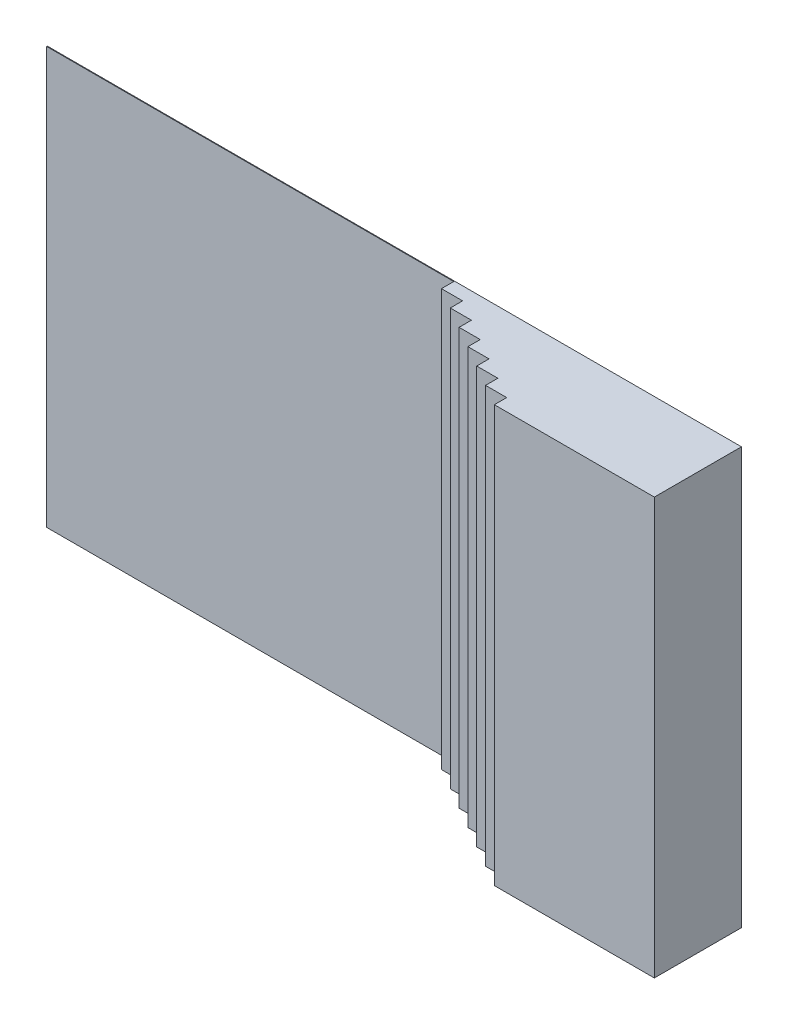
ISO-10303-21;
HEADER;
FILE_DESCRIPTION(('STEP AP214'),'2;1');
FILE_NAME('part.step','',(''),(''),'','','');
FILE_SCHEMA(('AUTOMOTIVE_DESIGN { 1 0 10303 214 1 1 1 1 }'));
ENDSEC;
DATA;
#1=APPLICATION_CONTEXT('core data for automotive mechanical design processes');
#2=APPLICATION_PROTOCOL_DEFINITION('international standard','automotive_design',2000,#1);
#3=PRODUCT_CONTEXT('',#1,'mechanical');
#4=PRODUCT('Part','Part','',(#3));
#5=PRODUCT_RELATED_PRODUCT_CATEGORY('part','',(#4));
#6=PRODUCT_DEFINITION_FORMATION('','',#4);
#7=PRODUCT_DEFINITION_CONTEXT('part definition',#1,'design');
#8=PRODUCT_DEFINITION('design','',#6,#7);
#9=PRODUCT_DEFINITION_SHAPE('','',#8);
#10=(LENGTH_UNIT() NAMED_UNIT(*) SI_UNIT(.MILLI.,.METRE.));
#11=(NAMED_UNIT(*) PLANE_ANGLE_UNIT() SI_UNIT($,.RADIAN.));
#12=(NAMED_UNIT(*) SI_UNIT($,.STERADIAN.) SOLID_ANGLE_UNIT());
#13=UNCERTAINTY_MEASURE_WITH_UNIT(LENGTH_MEASURE(1.E-05),#10,'distance_accuracy_value','');
#14=(GEOMETRIC_REPRESENTATION_CONTEXT(3) GLOBAL_UNCERTAINTY_ASSIGNED_CONTEXT((#13)) GLOBAL_UNIT_ASSIGNED_CONTEXT((#10,
#11,#12)) REPRESENTATION_CONTEXT('',''));
#15=CARTESIAN_POINT('',(0.,0.,0.));
#16=DIRECTION('',(0.,0.,1.));
#17=DIRECTION('',(1.,0.,0.));
#18=AXIS2_PLACEMENT_3D('',#15,#16,#17);
#19=CARTESIAN_POINT('',(-2500.,3000.,-10.));
#20=DIRECTION('',(-1.,0.,0.));
#21=DIRECTION('',(0.,-1.,0.));
#22=AXIS2_PLACEMENT_3D('',#19,#20,#21);
#23=PLANE('',#22);
#24=DIRECTION('',(0.,-1.,0.));
#25=VECTOR('',#24,1.);
#26=CARTESIAN_POINT('',(-2500.,3000.,0.));
#27=LINE('',#26,#25);
#28=CARTESIAN_POINT('',(-2500.,3000.,0.));
#29=VERTEX_POINT('',#28);
#30=CARTESIAN_POINT('',(-2500.,-3000.,0.));
#31=VERTEX_POINT('',#30);
#32=EDGE_CURVE('E298',#29,#31,#27,.T.);
#33=ORIENTED_EDGE('',*,*,#32,.F.);
#34=DIRECTION('',(0.,0.,1.));
#35=VECTOR('',#34,1.);
#36=CARTESIAN_POINT('',(-2500.,3000.,-10.));
#37=LINE('',#36,#35);
#38=CARTESIAN_POINT('',(-2500.,3000.,-10.));
#39=VERTEX_POINT('',#38);
#40=EDGE_CURVE('E11',#39,#29,#37,.T.);
#41=ORIENTED_EDGE('',*,*,#40,.F.);
#42=DIRECTION('',(0.,-1.,0.));
#43=VECTOR('',#42,1.);
#44=CARTESIAN_POINT('',(-2500.,3000.,-10.));
#45=LINE('',#44,#43);
#46=CARTESIAN_POINT('',(-2500.,-3000.,-10.));
#47=VERTEX_POINT('',#46);
#48=EDGE_CURVE('E299',#39,#47,#45,.T.);
#49=ORIENTED_EDGE('',*,*,#48,.T.);
#50=DIRECTION('',(0.,0.,1.));
#51=VECTOR('',#50,1.);
#52=CARTESIAN_POINT('',(-2500.,-3000.,-10.));
#53=LINE('',#52,#51);
#54=EDGE_CURVE('E46',#47,#31,#53,.T.);
#55=ORIENTED_EDGE('',*,*,#54,.T.);
#56=EDGE_LOOP('',(#33,#41,#49,#55));
#57=FACE_BOUND('',#56,.T.);
#58=ADVANCED_FACE('F43',(#57),#23,.T.);
#59=CARTESIAN_POINT('',(-2500.,3000.,-10.));
#60=DIRECTION('',(0.,1.,0.));
#61=DIRECTION('',(0.,0.,1.));
#62=AXIS2_PLACEMENT_3D('',#59,#60,#61);
#63=PLANE('',#62);
#64=DIRECTION('',(-1.,0.,0.));
#65=VECTOR('',#64,1.);
#66=CARTESIAN_POINT('',(-2500.,3000.,0.));
#67=LINE('',#66,#65);
#68=CARTESIAN_POINT('',(3366.4,3000.,0.));
#69=VERTEX_POINT('',#68);
#70=EDGE_CURVE('E80',#69,#29,#67,.T.);
#71=ORIENTED_EDGE('',*,*,#70,.F.);
#72=DIRECTION('',(0.,0.,-1.));
#73=VECTOR('',#72,1.);
#74=CARTESIAN_POINT('',(3366.4,3000.,0.));
#75=LINE('',#74,#73);
#76=CARTESIAN_POINT('',(3366.4,3000.,177.8));
#77=VERTEX_POINT('',#76);
#78=EDGE_CURVE('E217',#77,#69,#75,.T.);
#79=ORIENTED_EDGE('',*,*,#78,.F.);
#80=DIRECTION('',(-1.,0.,0.));
#81=VECTOR('',#80,1.);
#82=CARTESIAN_POINT('',(3366.4,3000.,177.8));
#83=LINE('',#82,#81);
#84=CARTESIAN_POINT('',(3671.2,3000.,177.8));
#85=VERTEX_POINT('',#84);
#86=EDGE_CURVE('E222',#85,#77,#83,.T.);
#87=ORIENTED_EDGE('',*,*,#86,.F.);
#88=DIRECTION('',(0.,0.,-1.));
#89=VECTOR('',#88,1.);
#90=CARTESIAN_POINT('',(3671.2,3000.,177.8));
#91=LINE('',#90,#89);
#92=CARTESIAN_POINT('',(3671.2,3000.,355.6));
#93=VERTEX_POINT('',#92);
#94=EDGE_CURVE('E227',#93,#85,#91,.T.);
#95=ORIENTED_EDGE('',*,*,#94,.F.);
#96=DIRECTION('',(-1.,0.,0.));
#97=VECTOR('',#96,1.);
#98=CARTESIAN_POINT('',(3671.2,3000.,355.6));
#99=LINE('',#98,#97);
#100=CARTESIAN_POINT('',(3976.,3000.,355.6));
#101=VERTEX_POINT('',#100);
#102=EDGE_CURVE('E232',#101,#93,#99,.T.);
#103=ORIENTED_EDGE('',*,*,#102,.F.);
#104=DIRECTION('',(0.,0.,-1.));
#105=VECTOR('',#104,1.);
#106=CARTESIAN_POINT('',(3976.,3000.,355.6));
#107=LINE('',#106,#105);
#108=CARTESIAN_POINT('',(3976.,3000.,533.4));
#109=VERTEX_POINT('',#108);
#110=EDGE_CURVE('E237',#109,#101,#107,.T.);
#111=ORIENTED_EDGE('',*,*,#110,.F.);
#112=DIRECTION('',(-1.,0.,0.));
#113=VECTOR('',#112,1.);
#114=CARTESIAN_POINT('',(3976.,3000.,533.4));
#115=LINE('',#114,#113);
#116=CARTESIAN_POINT('',(4280.8,3000.,533.4));
#117=VERTEX_POINT('',#116);
#118=EDGE_CURVE('E242',#117,#109,#115,.T.);
#119=ORIENTED_EDGE('',*,*,#118,.F.);
#120=DIRECTION('',(0.,0.,-1.));
#121=VECTOR('',#120,1.);
#122=CARTESIAN_POINT('',(4280.8,3000.,533.4));
#123=LINE('',#122,#121);
#124=CARTESIAN_POINT('',(4280.8,3000.,711.199999999999));
#125=VERTEX_POINT('',#124);
#126=EDGE_CURVE('E247',#125,#117,#123,.T.);
#127=ORIENTED_EDGE('',*,*,#126,.F.);
#128=DIRECTION('',(-1.,0.,0.));
#129=VECTOR('',#128,1.);
#130=CARTESIAN_POINT('',(4280.8,3000.,711.199999999999));
#131=LINE('',#130,#129);
#132=CARTESIAN_POINT('',(4585.6,3000.,711.199999999999));
#133=VERTEX_POINT('',#132);
#134=EDGE_CURVE('E252',#133,#125,#131,.T.);
#135=ORIENTED_EDGE('',*,*,#134,.F.);
#136=DIRECTION('',(0.,0.,-1.));
#137=VECTOR('',#136,1.);
#138=CARTESIAN_POINT('',(4585.6,3000.,711.199999999999));
#139=LINE('',#138,#137);
#140=CARTESIAN_POINT('',(4585.6,3000.,888.999999999999));
#141=VERTEX_POINT('',#140);
#142=EDGE_CURVE('E257',#141,#133,#139,.T.);
#143=ORIENTED_EDGE('',*,*,#142,.F.);
#144=DIRECTION('',(-1.,0.,0.));
#145=VECTOR('',#144,1.);
#146=CARTESIAN_POINT('',(4585.6,3000.,888.999999999999));
#147=LINE('',#146,#145);
#148=CARTESIAN_POINT('',(4890.4,3000.,888.999999999999));
#149=VERTEX_POINT('',#148);
#150=EDGE_CURVE('E262',#149,#141,#147,.T.);
#151=ORIENTED_EDGE('',*,*,#150,.F.);
#152=DIRECTION('',(0.,0.,-1.));
#153=VECTOR('',#152,1.);
#154=CARTESIAN_POINT('',(4890.4,3000.,888.999999999999));
#155=LINE('',#154,#153);
#156=CARTESIAN_POINT('',(4890.4,3000.,1066.8));
#157=VERTEX_POINT('',#156);
#158=EDGE_CURVE('E183',#157,#149,#155,.T.);
#159=ORIENTED_EDGE('',*,*,#158,.F.);
#160=DIRECTION('',(-1.,0.,0.));
#161=VECTOR('',#160,1.);
#162=CARTESIAN_POINT('',(4890.4,3000.,1066.8));
#163=LINE('',#162,#161);
#164=CARTESIAN_POINT('',(5195.2,3000.,1066.8));
#165=VERTEX_POINT('',#164);
#166=EDGE_CURVE('E175',#165,#157,#163,.T.);
#167=ORIENTED_EDGE('',*,*,#166,.F.);
#168=DIRECTION('',(0.,0.,-1.));
#169=VECTOR('',#168,1.);
#170=CARTESIAN_POINT('',(5195.2,3000.,1066.8));
#171=LINE('',#170,#169);
#172=CARTESIAN_POINT('',(5195.2,3000.,1244.6));
#173=VERTEX_POINT('',#172);
#174=EDGE_CURVE('E180',#173,#165,#171,.T.);
#175=ORIENTED_EDGE('',*,*,#174,.F.);
#176=DIRECTION('',(-1.,0.,0.));
#177=VECTOR('',#176,1.);
#178=CARTESIAN_POINT('',(5500.,3000.,1244.6));
#179=LINE('',#178,#177);
#180=CARTESIAN_POINT('',(7500.,3000.,1244.6));
#181=VERTEX_POINT('',#180);
#182=EDGE_CURVE('E213',#181,#173,#179,.T.);
#183=ORIENTED_EDGE('',*,*,#182,.F.);
#184=DIRECTION('',(0.,0.,1.));
#185=VECTOR('',#184,1.);
#186=CARTESIAN_POINT('',(7500.,3000.,-10.));
#187=LINE('',#186,#185);
#188=CARTESIAN_POINT('',(7500.,3000.,-10.));
#189=VERTEX_POINT('',#188);
#190=EDGE_CURVE('E52',#189,#181,#187,.T.);
#191=ORIENTED_EDGE('',*,*,#190,.F.);
#192=DIRECTION('',(-1.,0.,0.));
#193=VECTOR('',#192,1.);
#194=CARTESIAN_POINT('',(-2500.,3000.,-10.));
#195=LINE('',#194,#193);
#196=EDGE_CURVE('E309',#189,#39,#195,.T.);
#197=ORIENTED_EDGE('',*,*,#196,.T.);
#198=ORIENTED_EDGE('',*,*,#40,.T.);
#199=EDGE_LOOP('',(#71,#79,#87,#95,#103,#111,#119,#127,#135,#143,#151,#159,#167,#175,#183,#191,
#197,#198));
#200=FACE_BOUND('',#199,.T.);
#201=ADVANCED_FACE('F177',(#200),#63,.T.);
#202=CARTESIAN_POINT('',(7500.,3000.,-10.));
#203=DIRECTION('',(1.,0.,0.));
#204=DIRECTION('',(0.,1.,0.));
#205=AXIS2_PLACEMENT_3D('',#202,#203,#204);
#206=PLANE('',#205);
#207=ORIENTED_EDGE('',*,*,#190,.T.);
#208=DIRECTION('',(0.,-1.,0.));
#209=VECTOR('',#208,1.);
#210=CARTESIAN_POINT('',(7500.,7316.90608190635,1244.6));
#211=LINE('',#210,#209);
#212=CARTESIAN_POINT('',(7500.,-3000.,1244.6));
#213=VERTEX_POINT('',#212);
#214=EDGE_CURVE('E216',#181,#213,#211,.T.);
#215=ORIENTED_EDGE('',*,*,#214,.T.);
#216=DIRECTION('',(0.,0.,1.));
#217=VECTOR('',#216,1.);
#218=CARTESIAN_POINT('',(7500.,-3000.,-10.));
#219=LINE('',#218,#217);
#220=CARTESIAN_POINT('',(7500.,-3000.,-10.));
#221=VERTEX_POINT('',#220);
#222=EDGE_CURVE('E321',#221,#213,#219,.T.);
#223=ORIENTED_EDGE('',*,*,#222,.F.);
#224=DIRECTION('',(0.,1.,0.));
#225=VECTOR('',#224,1.);
#226=CARTESIAN_POINT('',(7500.,3000.,-10.));
#227=LINE('',#226,#225);
#228=EDGE_CURVE('E305',#221,#189,#227,.T.);
#229=ORIENTED_EDGE('',*,*,#228,.T.);
#230=EDGE_LOOP('',(#207,#215,#223,#229));
#231=FACE_BOUND('',#230,.T.);
#232=ADVANCED_FACE('F344',(#231),#206,.T.);
#233=CARTESIAN_POINT('',(-2500.,-3000.,-10.));
#234=DIRECTION('',(0.,-1.,0.));
#235=DIRECTION('',(0.,0.,-1.));
#236=AXIS2_PLACEMENT_3D('',#233,#234,#235);
#237=PLANE('',#236);
#238=DIRECTION('',(1.,0.,0.));
#239=VECTOR('',#238,1.);
#240=CARTESIAN_POINT('',(-2500.,-3000.,0.));
#241=LINE('',#240,#239);
#242=CARTESIAN_POINT('',(3366.4,-3000.,0.));
#243=VERTEX_POINT('',#242);
#244=EDGE_CURVE('E315',#31,#243,#241,.T.);
#245=ORIENTED_EDGE('',*,*,#244,.F.);
#246=ORIENTED_EDGE('',*,*,#54,.F.);
#247=DIRECTION('',(1.,0.,0.));
#248=VECTOR('',#247,1.);
#249=CARTESIAN_POINT('',(-2500.,-3000.,-10.));
#250=LINE('',#249,#248);
#251=EDGE_CURVE('E302',#47,#221,#250,.T.);
#252=ORIENTED_EDGE('',*,*,#251,.T.);
#253=ORIENTED_EDGE('',*,*,#222,.T.);
#254=DIRECTION('',(-1.,0.,0.));
#255=VECTOR('',#254,1.);
#256=CARTESIAN_POINT('',(5500.,-3000.,1244.6));
#257=LINE('',#256,#255);
#258=CARTESIAN_POINT('',(5195.2,-3000.,1244.6));
#259=VERTEX_POINT('',#258);
#260=EDGE_CURVE('E554',#213,#259,#257,.T.);
#261=ORIENTED_EDGE('',*,*,#260,.T.);
#262=DIRECTION('',(0.,0.,-1.));
#263=VECTOR('',#262,1.);
#264=CARTESIAN_POINT('',(5195.2,-3000.,1066.8));
#265=LINE('',#264,#263);
#266=CARTESIAN_POINT('',(5195.2,-3000.,1066.8));
#267=VERTEX_POINT('',#266);
#268=EDGE_CURVE('E211',#259,#267,#265,.T.);
#269=ORIENTED_EDGE('',*,*,#268,.T.);
#270=DIRECTION('',(-1.,0.,0.));
#271=VECTOR('',#270,1.);
#272=CARTESIAN_POINT('',(4890.4,-3000.,1066.8));
#273=LINE('',#272,#271);
#274=CARTESIAN_POINT('',(4890.4,-3000.,1066.8));
#275=VERTEX_POINT('',#274);
#276=EDGE_CURVE('E193',#267,#275,#273,.T.);
#277=ORIENTED_EDGE('',*,*,#276,.T.);
#278=DIRECTION('',(0.,0.,-1.));
#279=VECTOR('',#278,1.);
#280=CARTESIAN_POINT('',(4890.4,-3000.,888.999999999999));
#281=LINE('',#280,#279);
#282=CARTESIAN_POINT('',(4890.4,-3000.,888.999999999999));
#283=VERTEX_POINT('',#282);
#284=EDGE_CURVE('E592',#275,#283,#281,.T.);
#285=ORIENTED_EDGE('',*,*,#284,.T.);
#286=DIRECTION('',(-1.,0.,0.));
#287=VECTOR('',#286,1.);
#288=CARTESIAN_POINT('',(4585.6,-3000.,888.999999999999));
#289=LINE('',#288,#287);
#290=CARTESIAN_POINT('',(4585.6,-3000.,888.999999999999));
#291=VERTEX_POINT('',#290);
#292=EDGE_CURVE('E589',#283,#291,#289,.T.);
#293=ORIENTED_EDGE('',*,*,#292,.T.);
#294=DIRECTION('',(0.,0.,-1.));
#295=VECTOR('',#294,1.);
#296=CARTESIAN_POINT('',(4585.6,-3000.,711.199999999999));
#297=LINE('',#296,#295);
#298=CARTESIAN_POINT('',(4585.6,-3000.,711.199999999999));
#299=VERTEX_POINT('',#298);
#300=EDGE_CURVE('E586',#291,#299,#297,.T.);
#301=ORIENTED_EDGE('',*,*,#300,.T.);
#302=DIRECTION('',(-1.,0.,0.));
#303=VECTOR('',#302,1.);
#304=CARTESIAN_POINT('',(4280.8,-3000.,711.199999999999));
#305=LINE('',#304,#303);
#306=CARTESIAN_POINT('',(4280.8,-3000.,711.199999999999));
#307=VERTEX_POINT('',#306);
#308=EDGE_CURVE('E602',#299,#307,#305,.T.);
#309=ORIENTED_EDGE('',*,*,#308,.T.);
#310=DIRECTION('',(0.,0.,-1.));
#311=VECTOR('',#310,1.);
#312=CARTESIAN_POINT('',(4280.8,-3000.,533.4));
#313=LINE('',#312,#311);
#314=CARTESIAN_POINT('',(4280.8,-3000.,533.4));
#315=VERTEX_POINT('',#314);
#316=EDGE_CURVE('E578',#307,#315,#313,.T.);
#317=ORIENTED_EDGE('',*,*,#316,.T.);
#318=DIRECTION('',(-1.,0.,0.));
#319=VECTOR('',#318,1.);
#320=CARTESIAN_POINT('',(3976.,-3000.,533.4));
#321=LINE('',#320,#319);
#322=CARTESIAN_POINT('',(3976.,-3000.,533.4));
#323=VERTEX_POINT('',#322);
#324=EDGE_CURVE('E575',#315,#323,#321,.T.);
#325=ORIENTED_EDGE('',*,*,#324,.T.);
#326=DIRECTION('',(0.,0.,-1.));
#327=VECTOR('',#326,1.);
#328=CARTESIAN_POINT('',(3976.,-3000.,355.6));
#329=LINE('',#328,#327);
#330=CARTESIAN_POINT('',(3976.,-3000.,355.6));
#331=VERTEX_POINT('',#330);
#332=EDGE_CURVE('E609',#323,#331,#329,.T.);
#333=ORIENTED_EDGE('',*,*,#332,.T.);
#334=DIRECTION('',(-1.,0.,0.));
#335=VECTOR('',#334,1.);
#336=CARTESIAN_POINT('',(3671.2,-3000.,355.6));
#337=LINE('',#336,#335);
#338=CARTESIAN_POINT('',(3671.2,-3000.,355.6));
#339=VERTEX_POINT('',#338);
#340=EDGE_CURVE('E567',#331,#339,#337,.T.);
#341=ORIENTED_EDGE('',*,*,#340,.T.);
#342=DIRECTION('',(0.,0.,-1.));
#343=VECTOR('',#342,1.);
#344=CARTESIAN_POINT('',(3671.2,-3000.,177.8));
#345=LINE('',#344,#343);
#346=CARTESIAN_POINT('',(3671.2,-3000.,177.8));
#347=VERTEX_POINT('',#346);
#348=EDGE_CURVE('E564',#339,#347,#345,.T.);
#349=ORIENTED_EDGE('',*,*,#348,.T.);
#350=DIRECTION('',(-1.,0.,0.));
#351=VECTOR('',#350,1.);
#352=CARTESIAN_POINT('',(3366.4,-3000.,177.8));
#353=LINE('',#352,#351);
#354=CARTESIAN_POINT('',(3366.4,-3000.,177.8));
#355=VERTEX_POINT('',#354);
#356=EDGE_CURVE('E207',#347,#355,#353,.T.);
#357=ORIENTED_EDGE('',*,*,#356,.T.);
#358=DIRECTION('',(0.,0.,-1.));
#359=VECTOR('',#358,1.);
#360=CARTESIAN_POINT('',(3366.4,-3000.,0.));
#361=LINE('',#360,#359);
#362=EDGE_CURVE('E203',#355,#243,#361,.T.);
#363=ORIENTED_EDGE('',*,*,#362,.T.);
#364=EDGE_LOOP('',(#245,#246,#252,#253,#261,#269,#277,#285,#293,#301,#309,#317,#325,#333,#341,
#349,#357,#363));
#365=FACE_BOUND('',#364,.T.);
#366=ADVANCED_FACE('F325',(#365),#237,.T.);
#367=CARTESIAN_POINT('',(0.,0.,-10.));
#368=DIRECTION('',(0.,0.,1.));
#369=DIRECTION('',(1.,0.,0.));
#370=AXIS2_PLACEMENT_3D('',#367,#368,#369);
#371=PLANE('',#370);
#372=ORIENTED_EDGE('',*,*,#48,.F.);
#373=ORIENTED_EDGE('',*,*,#196,.F.);
#374=ORIENTED_EDGE('',*,*,#228,.F.);
#375=ORIENTED_EDGE('',*,*,#251,.F.);
#376=EDGE_LOOP('',(#372,#373,#374,#375));
#377=FACE_BOUND('',#376,.T.);
#378=ADVANCED_FACE('F330',(#377),#371,.F.);
#379=CARTESIAN_POINT('',(0.,0.,0.));
#380=DIRECTION('',(0.,0.,1.));
#381=DIRECTION('',(1.,0.,0.));
#382=AXIS2_PLACEMENT_3D('',#379,#380,#381);
#383=PLANE('',#382);
#384=DIRECTION('',(0.,-1.,0.));
#385=VECTOR('',#384,1.);
#386=CARTESIAN_POINT('',(3366.4,7316.90608190635,0.));
#387=LINE('',#386,#385);
#388=EDGE_CURVE('E60',#69,#243,#387,.T.);
#389=ORIENTED_EDGE('',*,*,#388,.F.);
#390=ORIENTED_EDGE('',*,*,#70,.T.);
#391=ORIENTED_EDGE('',*,*,#32,.T.);
#392=ORIENTED_EDGE('',*,*,#244,.T.);
#393=EDGE_LOOP('',(#389,#390,#391,#392));
#394=FACE_BOUND('',#393,.T.);
#395=ADVANCED_FACE('F328',(#394),#383,.T.);
#396=CARTESIAN_POINT('',(5195.2,7316.90608190635,1066.8));
#397=DIRECTION('',(-1.,0.,0.));
#398=DIRECTION('',(0.,0.,1.));
#399=AXIS2_PLACEMENT_3D('',#396,#397,#398);
#400=PLANE('',#399);
#401=DIRECTION('',(0.,-1.,0.));
#402=VECTOR('',#401,1.);
#403=CARTESIAN_POINT('',(5195.2,7316.90608190635,1244.6));
#404=LINE('',#403,#402);
#405=EDGE_CURVE('E201',#173,#259,#404,.T.);
#406=ORIENTED_EDGE('',*,*,#405,.F.);
#407=ORIENTED_EDGE('',*,*,#174,.T.);
#408=DIRECTION('',(0.,-1.,0.));
#409=VECTOR('',#408,1.);
#410=CARTESIAN_POINT('',(5195.2,7316.90608190635,1066.8));
#411=LINE('',#410,#409);
#412=EDGE_CURVE('E188',#165,#267,#411,.T.);
#413=ORIENTED_EDGE('',*,*,#412,.T.);
#414=ORIENTED_EDGE('',*,*,#268,.F.);
#415=EDGE_LOOP('',(#406,#407,#413,#414));
#416=FACE_BOUND('',#415,.T.);
#417=ADVANCED_FACE('F200',(#416),#400,.T.);
#418=CARTESIAN_POINT('',(4890.4,7316.90608190635,1066.8));
#419=DIRECTION('',(0.,0.,1.));
#420=DIRECTION('',(1.,0.,0.));
#421=AXIS2_PLACEMENT_3D('',#418,#419,#420);
#422=PLANE('',#421);
#423=ORIENTED_EDGE('',*,*,#412,.F.);
#424=ORIENTED_EDGE('',*,*,#166,.T.);
#425=DIRECTION('',(0.,-1.,0.));
#426=VECTOR('',#425,1.);
#427=CARTESIAN_POINT('',(4890.4,7316.90608190635,1066.8));
#428=LINE('',#427,#426);
#429=EDGE_CURVE('E187',#157,#275,#428,.T.);
#430=ORIENTED_EDGE('',*,*,#429,.T.);
#431=ORIENTED_EDGE('',*,*,#276,.F.);
#432=EDGE_LOOP('',(#423,#424,#430,#431));
#433=FACE_BOUND('',#432,.T.);
#434=ADVANCED_FACE('F191',(#433),#422,.T.);
#435=CARTESIAN_POINT('',(4890.4,7316.90608190635,888.999999999999));
#436=DIRECTION('',(-1.,0.,0.));
#437=DIRECTION('',(0.,0.,1.));
#438=AXIS2_PLACEMENT_3D('',#435,#436,#437);
#439=PLANE('',#438);
#440=ORIENTED_EDGE('',*,*,#429,.F.);
#441=ORIENTED_EDGE('',*,*,#158,.T.);
#442=DIRECTION('',(0.,-1.,0.));
#443=VECTOR('',#442,1.);
#444=CARTESIAN_POINT('',(4890.4,7316.90608190635,888.999999999999));
#445=LINE('',#444,#443);
#446=EDGE_CURVE('E266',#149,#283,#445,.T.);
#447=ORIENTED_EDGE('',*,*,#446,.T.);
#448=ORIENTED_EDGE('',*,*,#284,.F.);
#449=EDGE_LOOP('',(#440,#441,#447,#448));
#450=FACE_BOUND('',#449,.T.);
#451=ADVANCED_FACE('F401',(#450),#439,.T.);
#452=CARTESIAN_POINT('',(4585.6,7316.90608190635,888.999999999999));
#453=DIRECTION('',(0.,0.,1.));
#454=DIRECTION('',(1.,0.,0.));
#455=AXIS2_PLACEMENT_3D('',#452,#453,#454);
#456=PLANE('',#455);
#457=ORIENTED_EDGE('',*,*,#446,.F.);
#458=ORIENTED_EDGE('',*,*,#150,.T.);
#459=DIRECTION('',(0.,-1.,0.));
#460=VECTOR('',#459,1.);
#461=CARTESIAN_POINT('',(4585.6,7316.90608190635,888.999999999999));
#462=LINE('',#461,#460);
#463=EDGE_CURVE('E261',#141,#291,#462,.T.);
#464=ORIENTED_EDGE('',*,*,#463,.T.);
#465=ORIENTED_EDGE('',*,*,#292,.F.);
#466=EDGE_LOOP('',(#457,#458,#464,#465));
#467=FACE_BOUND('',#466,.T.);
#468=ADVANCED_FACE('F411',(#467),#456,.T.);
#469=CARTESIAN_POINT('',(4585.6,7316.90608190635,711.199999999999));
#470=DIRECTION('',(-1.,0.,0.));
#471=DIRECTION('',(0.,0.,1.));
#472=AXIS2_PLACEMENT_3D('',#469,#470,#471);
#473=PLANE('',#472);
#474=ORIENTED_EDGE('',*,*,#463,.F.);
#475=ORIENTED_EDGE('',*,*,#142,.T.);
#476=DIRECTION('',(0.,-1.,0.));
#477=VECTOR('',#476,1.);
#478=CARTESIAN_POINT('',(4585.6,7316.90608190635,711.199999999999));
#479=LINE('',#478,#477);
#480=EDGE_CURVE('E256',#133,#299,#479,.T.);
#481=ORIENTED_EDGE('',*,*,#480,.T.);
#482=ORIENTED_EDGE('',*,*,#300,.F.);
#483=EDGE_LOOP('',(#474,#475,#481,#482));
#484=FACE_BOUND('',#483,.T.);
#485=ADVANCED_FACE('F422',(#484),#473,.T.);
#486=CARTESIAN_POINT('',(4280.8,7316.90608190635,711.199999999999));
#487=DIRECTION('',(0.,0.,1.));
#488=DIRECTION('',(1.,0.,0.));
#489=AXIS2_PLACEMENT_3D('',#486,#487,#488);
#490=PLANE('',#489);
#491=ORIENTED_EDGE('',*,*,#480,.F.);
#492=ORIENTED_EDGE('',*,*,#134,.T.);
#493=DIRECTION('',(0.,-1.,0.));
#494=VECTOR('',#493,1.);
#495=CARTESIAN_POINT('',(4280.8,7316.90608190635,711.199999999999));
#496=LINE('',#495,#494);
#497=EDGE_CURVE('E251',#125,#307,#496,.T.);
#498=ORIENTED_EDGE('',*,*,#497,.T.);
#499=ORIENTED_EDGE('',*,*,#308,.F.);
#500=EDGE_LOOP('',(#491,#492,#498,#499));
#501=FACE_BOUND('',#500,.T.);
#502=ADVANCED_FACE('F433',(#501),#490,.T.);
#503=CARTESIAN_POINT('',(4280.8,7316.90608190635,533.4));
#504=DIRECTION('',(-1.,0.,0.));
#505=DIRECTION('',(0.,0.,1.));
#506=AXIS2_PLACEMENT_3D('',#503,#504,#505);
#507=PLANE('',#506);
#508=ORIENTED_EDGE('',*,*,#497,.F.);
#509=ORIENTED_EDGE('',*,*,#126,.T.);
#510=DIRECTION('',(0.,-1.,0.));
#511=VECTOR('',#510,1.);
#512=CARTESIAN_POINT('',(4280.8,7316.90608190635,533.4));
#513=LINE('',#512,#511);
#514=EDGE_CURVE('E246',#117,#315,#513,.T.);
#515=ORIENTED_EDGE('',*,*,#514,.T.);
#516=ORIENTED_EDGE('',*,*,#316,.F.);
#517=EDGE_LOOP('',(#508,#509,#515,#516));
#518=FACE_BOUND('',#517,.T.);
#519=ADVANCED_FACE('F444',(#518),#507,.T.);
#520=CARTESIAN_POINT('',(3976.,7316.90608190635,533.4));
#521=DIRECTION('',(0.,0.,1.));
#522=DIRECTION('',(1.,0.,0.));
#523=AXIS2_PLACEMENT_3D('',#520,#521,#522);
#524=PLANE('',#523);
#525=ORIENTED_EDGE('',*,*,#514,.F.);
#526=ORIENTED_EDGE('',*,*,#118,.T.);
#527=DIRECTION('',(0.,-1.,0.));
#528=VECTOR('',#527,1.);
#529=CARTESIAN_POINT('',(3976.,7316.90608190635,533.4));
#530=LINE('',#529,#528);
#531=EDGE_CURVE('E241',#109,#323,#530,.T.);
#532=ORIENTED_EDGE('',*,*,#531,.T.);
#533=ORIENTED_EDGE('',*,*,#324,.F.);
#534=EDGE_LOOP('',(#525,#526,#532,#533));
#535=FACE_BOUND('',#534,.T.);
#536=ADVANCED_FACE('F455',(#535),#524,.T.);
#537=CARTESIAN_POINT('',(3976.,7316.90608190635,355.6));
#538=DIRECTION('',(-1.,0.,0.));
#539=DIRECTION('',(0.,0.,1.));
#540=AXIS2_PLACEMENT_3D('',#537,#538,#539);
#541=PLANE('',#540);
#542=ORIENTED_EDGE('',*,*,#531,.F.);
#543=ORIENTED_EDGE('',*,*,#110,.T.);
#544=DIRECTION('',(0.,-1.,0.));
#545=VECTOR('',#544,1.);
#546=CARTESIAN_POINT('',(3976.,7316.90608190635,355.6));
#547=LINE('',#546,#545);
#548=EDGE_CURVE('E236',#101,#331,#547,.T.);
#549=ORIENTED_EDGE('',*,*,#548,.T.);
#550=ORIENTED_EDGE('',*,*,#332,.F.);
#551=EDGE_LOOP('',(#542,#543,#549,#550));
#552=FACE_BOUND('',#551,.T.);
#553=ADVANCED_FACE('F466',(#552),#541,.T.);
#554=CARTESIAN_POINT('',(3671.2,7316.90608190635,355.6));
#555=DIRECTION('',(0.,0.,1.));
#556=DIRECTION('',(1.,0.,0.));
#557=AXIS2_PLACEMENT_3D('',#554,#555,#556);
#558=PLANE('',#557);
#559=ORIENTED_EDGE('',*,*,#548,.F.);
#560=ORIENTED_EDGE('',*,*,#102,.T.);
#561=DIRECTION('',(0.,-1.,0.));
#562=VECTOR('',#561,1.);
#563=CARTESIAN_POINT('',(3671.2,7316.90608190635,355.6));
#564=LINE('',#563,#562);
#565=EDGE_CURVE('E231',#93,#339,#564,.T.);
#566=ORIENTED_EDGE('',*,*,#565,.T.);
#567=ORIENTED_EDGE('',*,*,#340,.F.);
#568=EDGE_LOOP('',(#559,#560,#566,#567));
#569=FACE_BOUND('',#568,.T.);
#570=ADVANCED_FACE('F477',(#569),#558,.T.);
#571=CARTESIAN_POINT('',(3671.2,7316.90608190635,177.8));
#572=DIRECTION('',(-1.,0.,0.));
#573=DIRECTION('',(0.,0.,1.));
#574=AXIS2_PLACEMENT_3D('',#571,#572,#573);
#575=PLANE('',#574);
#576=ORIENTED_EDGE('',*,*,#565,.F.);
#577=ORIENTED_EDGE('',*,*,#94,.T.);
#578=DIRECTION('',(0.,-1.,0.));
#579=VECTOR('',#578,1.);
#580=CARTESIAN_POINT('',(3671.2,7316.90608190635,177.8));
#581=LINE('',#580,#579);
#582=EDGE_CURVE('E226',#85,#347,#581,.T.);
#583=ORIENTED_EDGE('',*,*,#582,.T.);
#584=ORIENTED_EDGE('',*,*,#348,.F.);
#585=EDGE_LOOP('',(#576,#577,#583,#584));
#586=FACE_BOUND('',#585,.T.);
#587=ADVANCED_FACE('F488',(#586),#575,.T.);
#588=CARTESIAN_POINT('',(3366.4,7316.90608190635,177.8));
#589=DIRECTION('',(0.,0.,1.));
#590=DIRECTION('',(1.,0.,0.));
#591=AXIS2_PLACEMENT_3D('',#588,#589,#590);
#592=PLANE('',#591);
#593=ORIENTED_EDGE('',*,*,#582,.F.);
#594=ORIENTED_EDGE('',*,*,#86,.T.);
#595=DIRECTION('',(0.,-1.,0.));
#596=VECTOR('',#595,1.);
#597=CARTESIAN_POINT('',(3366.4,7316.90608190635,177.8));
#598=LINE('',#597,#596);
#599=EDGE_CURVE('E221',#77,#355,#598,.T.);
#600=ORIENTED_EDGE('',*,*,#599,.T.);
#601=ORIENTED_EDGE('',*,*,#356,.F.);
#602=EDGE_LOOP('',(#593,#594,#600,#601));
#603=FACE_BOUND('',#602,.T.);
#604=ADVANCED_FACE('F499',(#603),#592,.T.);
#605=CARTESIAN_POINT('',(3366.4,7316.90608190635,0.));
#606=DIRECTION('',(-1.,0.,0.));
#607=DIRECTION('',(0.,0.,1.));
#608=AXIS2_PLACEMENT_3D('',#605,#606,#607);
#609=PLANE('',#608);
#610=ORIENTED_EDGE('',*,*,#599,.F.);
#611=ORIENTED_EDGE('',*,*,#78,.T.);
#612=ORIENTED_EDGE('',*,*,#388,.T.);
#613=ORIENTED_EDGE('',*,*,#362,.F.);
#614=EDGE_LOOP('',(#610,#611,#612,#613));
#615=FACE_BOUND('',#614,.T.);
#616=ADVANCED_FACE('F510',(#615),#609,.T.);
#617=CARTESIAN_POINT('',(5500.,7316.90608190635,1244.6));
#618=DIRECTION('',(0.,0.,1.));
#619=DIRECTION('',(1.,0.,0.));
#620=AXIS2_PLACEMENT_3D('',#617,#618,#619);
#621=PLANE('',#620);
#622=ORIENTED_EDGE('',*,*,#214,.F.);
#623=ORIENTED_EDGE('',*,*,#182,.T.);
#624=ORIENTED_EDGE('',*,*,#405,.T.);
#625=ORIENTED_EDGE('',*,*,#260,.F.);
#626=EDGE_LOOP('',(#622,#623,#624,#625));
#627=FACE_BOUND('',#626,.T.);
#628=ADVANCED_FACE('F521',(#627),#621,.T.);
#629=CLOSED_SHELL('',(#58,#201,#232,#366,#378,#395,#417,#434,#451,#468,#485,#502,#519,#536,#553,
#570,#587,#604,#616,#628));
#630=MANIFOLD_SOLID_BREP('B2',#629);
#631=ADVANCED_BREP_SHAPE_REPRESENTATION('',(#18,#630),#14);
#632=SHAPE_DEFINITION_REPRESENTATION(#9,#631);
ENDSEC;
END-ISO-10303-21;
